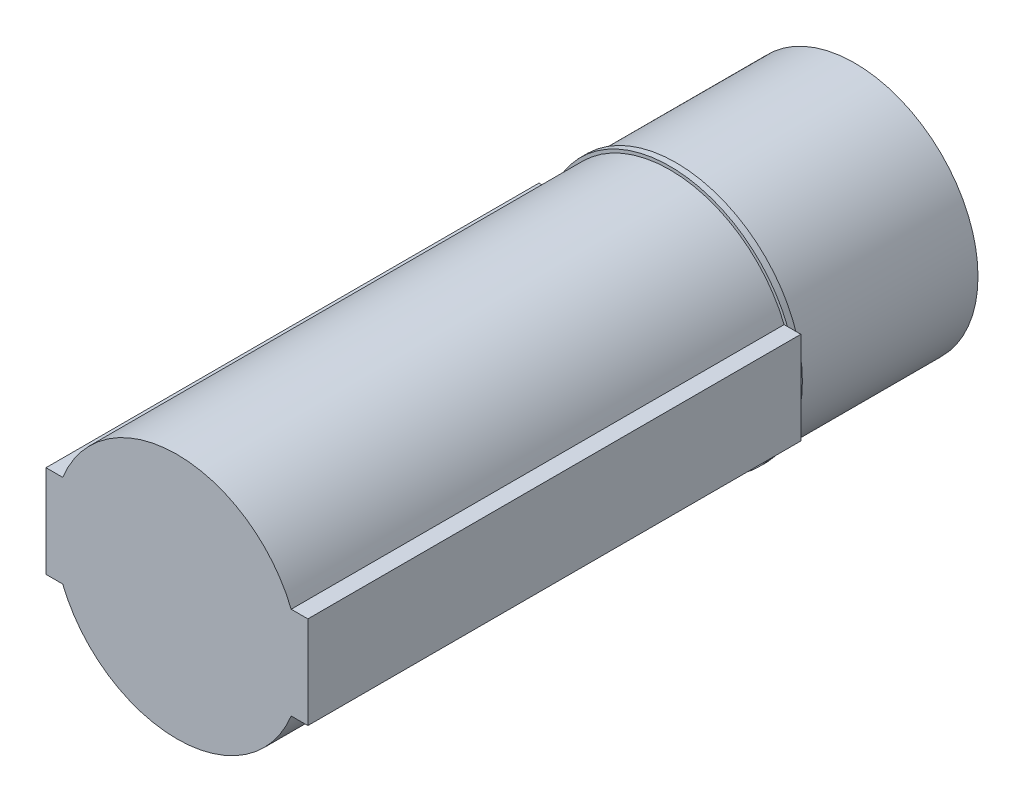
ISO-10303-21;
HEADER;
FILE_DESCRIPTION(('STEP AP214'),'2;1');
FILE_NAME('part.step','',(''),(''),'','','');
FILE_SCHEMA(('AUTOMOTIVE_DESIGN { 1 0 10303 214 1 1 1 1 }'));
ENDSEC;
DATA;
#1=APPLICATION_CONTEXT('core data for automotive mechanical design processes');
#2=APPLICATION_PROTOCOL_DEFINITION('international standard','automotive_design',2000,#1);
#3=PRODUCT_CONTEXT('',#1,'mechanical');
#4=PRODUCT('Part','Part','',(#3));
#5=PRODUCT_RELATED_PRODUCT_CATEGORY('part','',(#4));
#6=PRODUCT_DEFINITION_FORMATION('','',#4);
#7=PRODUCT_DEFINITION_CONTEXT('part definition',#1,'design');
#8=PRODUCT_DEFINITION('design','',#6,#7);
#9=PRODUCT_DEFINITION_SHAPE('','',#8);
#10=(LENGTH_UNIT() NAMED_UNIT(*) SI_UNIT(.MILLI.,.METRE.));
#11=(NAMED_UNIT(*) PLANE_ANGLE_UNIT() SI_UNIT($,.RADIAN.));
#12=(NAMED_UNIT(*) SI_UNIT($,.STERADIAN.) SOLID_ANGLE_UNIT());
#13=UNCERTAINTY_MEASURE_WITH_UNIT(LENGTH_MEASURE(1.E-05),#10,'distance_accuracy_value','');
#14=(GEOMETRIC_REPRESENTATION_CONTEXT(3) GLOBAL_UNCERTAINTY_ASSIGNED_CONTEXT((#13)) GLOBAL_UNIT_ASSIGNED_CONTEXT((#10,
#11,#12)) REPRESENTATION_CONTEXT('',''));
#15=CARTESIAN_POINT('',(0.,0.,0.));
#16=DIRECTION('',(0.,0.,1.));
#17=DIRECTION('',(1.,0.,0.));
#18=AXIS2_PLACEMENT_3D('',#15,#16,#17);
#19=CARTESIAN_POINT('',(0.,0.,7.));
#20=DIRECTION('',(0.,0.,-1.));
#21=DIRECTION('',(-1.,0.,0.));
#22=AXIS2_PLACEMENT_3D('',#19,#20,#21);
#23=CYLINDRICAL_SURFACE('',#22,2.);
#24=CARTESIAN_POINT('',(0.,0.,3.));
#25=DIRECTION('',(0.,0.,1.));
#26=DIRECTION('',(1.,0.,0.));
#27=AXIS2_PLACEMENT_3D('',#24,#25,#26);
#28=CIRCLE('',#27,2.);
#29=CARTESIAN_POINT('',(1.85404962177392,0.75,3.));
#30=VERTEX_POINT('',#29);
#31=CARTESIAN_POINT('',(-1.85404962177392,0.75,3.));
#32=VERTEX_POINT('',#31);
#33=EDGE_CURVE('E206',#30,#32,#28,.T.);
#34=ORIENTED_EDGE('',*,*,#33,.T.);
#35=DIRECTION('',(0.,0.,-1.));
#36=VECTOR('',#35,1.);
#37=CARTESIAN_POINT('',(-1.85404962177392,0.75,11.));
#38=LINE('',#37,#36);
#39=CARTESIAN_POINT('',(-1.85404962177392,0.75,11.));
#40=VERTEX_POINT('',#39);
#41=EDGE_CURVE('E190',#40,#32,#38,.T.);
#42=ORIENTED_EDGE('',*,*,#41,.F.);
#43=CARTESIAN_POINT('',(0.,0.,11.));
#44=DIRECTION('',(0.,0.,1.));
#45=DIRECTION('',(1.,0.,0.));
#46=AXIS2_PLACEMENT_3D('',#43,#44,#45);
#47=CIRCLE('',#46,2.);
#48=CARTESIAN_POINT('',(1.85404962177392,0.75,11.));
#49=VERTEX_POINT('',#48);
#50=EDGE_CURVE('E172',#49,#40,#47,.T.);
#51=ORIENTED_EDGE('',*,*,#50,.F.);
#52=DIRECTION('',(0.,0.,-1.));
#53=VECTOR('',#52,1.);
#54=CARTESIAN_POINT('',(1.85404962177392,0.75,11.));
#55=LINE('',#54,#53);
#56=EDGE_CURVE('E192',#49,#30,#55,.T.);
#57=ORIENTED_EDGE('',*,*,#56,.T.);
#58=EDGE_LOOP('',(#34,#42,#51,#57));
#59=FACE_BOUND('',#58,.T.);
#60=ADVANCED_FACE('F34',(#59),#23,.T.);
#61=CARTESIAN_POINT('',(0.,0.,3.));
#62=DIRECTION('',(0.,0.,1.));
#63=DIRECTION('',(1.,0.,0.));
#64=AXIS2_PLACEMENT_3D('',#61,#62,#63);
#65=PLANE('',#64);
#66=DIRECTION('',(-1.,0.,0.));
#67=VECTOR('',#66,1.);
#68=CARTESIAN_POINT('',(-1.85404962177392,0.75,3.));
#69=LINE('',#68,#67);
#70=CARTESIAN_POINT('',(-1.90787840283389,0.75,3.));
#71=VERTEX_POINT('',#70);
#72=EDGE_CURVE('E153',#32,#71,#69,.T.);
#73=ORIENTED_EDGE('',*,*,#72,.F.);
#74=ORIENTED_EDGE('',*,*,#33,.F.);
#75=DIRECTION('',(-1.,0.,0.));
#76=VECTOR('',#75,1.);
#77=CARTESIAN_POINT('',(2.125,0.75,3.));
#78=LINE('',#77,#76);
#79=CARTESIAN_POINT('',(1.90787840283389,0.75,3.));
#80=VERTEX_POINT('',#79);
#81=EDGE_CURVE('E163',#80,#30,#78,.T.);
#82=ORIENTED_EDGE('',*,*,#81,.F.);
#83=CARTESIAN_POINT('',(0.,0.,3.));
#84=DIRECTION('',(0.,0.,1.));
#85=DIRECTION('',(1.,0.,0.));
#86=AXIS2_PLACEMENT_3D('',#83,#84,#85);
#87=CIRCLE('',#86,2.05);
#88=EDGE_CURVE('E210',#80,#71,#87,.T.);
#89=ORIENTED_EDGE('',*,*,#88,.T.);
#90=EDGE_LOOP('',(#73,#74,#82,#89));
#91=FACE_BOUND('',#90,.T.);
#92=ADVANCED_FACE('F227',(#91),#65,.T.);
#93=CARTESIAN_POINT('',(0.,0.,0.));
#94=DIRECTION('',(0.,0.,1.));
#95=DIRECTION('',(1.,0.,0.));
#96=AXIS2_PLACEMENT_3D('',#93,#94,#95);
#97=PLANE('',#96);
#98=CARTESIAN_POINT('',(0.,0.,0.));
#99=DIRECTION('',(0.,0.,1.));
#100=DIRECTION('',(1.,0.,0.));
#101=AXIS2_PLACEMENT_3D('',#98,#99,#100);
#102=CIRCLE('',#101,1.5);
#103=CARTESIAN_POINT('',(0.997797574661314,1.12,0.));
#104=VERTEX_POINT('',#103);
#105=CARTESIAN_POINT('',(0.997797574661314,-1.12,0.));
#106=VERTEX_POINT('',#105);
#107=EDGE_CURVE('E55',#104,#106,#102,.T.);
#108=ORIENTED_EDGE('',*,*,#107,.T.);
#109=DIRECTION('',(0.,1.,0.));
#110=VECTOR('',#109,1.);
#111=CARTESIAN_POINT('',(0.997797574661314,1.12,0.));
#112=LINE('',#111,#110);
#113=EDGE_CURVE('E217',#106,#104,#112,.T.);
#114=ORIENTED_EDGE('',*,*,#113,.T.);
#115=EDGE_LOOP('',(#108,#114));
#116=FACE_BOUND('',#115,.T.);
#117=CARTESIAN_POINT('',(0.,0.,0.));
#118=DIRECTION('',(0.,0.,1.));
#119=DIRECTION('',(1.,0.,0.));
#120=AXIS2_PLACEMENT_3D('',#117,#118,#119);
#121=CIRCLE('',#120,2.);
#122=CARTESIAN_POINT('',(2.,0.,0.));
#123=VERTEX_POINT('',#122);
#124=EDGE_CURVE('E196',#123,#123,#121,.T.);
#125=ORIENTED_EDGE('',*,*,#124,.F.);
#126=EDGE_LOOP('',(#125));
#127=FACE_BOUND('',#126,.T.);
#128=ADVANCED_FACE('F224',(#116,#127),#97,.F.);
#129=DIRECTION('',(0.,0.,-1.));
#130=VECTOR('',#129,1.);
#131=CARTESIAN_POINT('',(-1.85404962177392,-0.75,11.));
#132=LINE('',#131,#130);
#133=CARTESIAN_POINT('',(-1.85404962177392,-0.75,11.));
#134=VERTEX_POINT('',#133);
#135=CARTESIAN_POINT('',(-1.85404962177392,-0.75,3.));
#136=VERTEX_POINT('',#135);
#137=EDGE_CURVE('E137',#134,#136,#132,.T.);
#138=ORIENTED_EDGE('',*,*,#137,.T.);
#139=CARTESIAN_POINT('',(1.85404962177392,-0.75,3.));
#140=VERTEX_POINT('',#139);
#141=EDGE_CURVE('E205',#136,#140,#28,.T.);
#142=ORIENTED_EDGE('',*,*,#141,.T.);
#143=DIRECTION('',(0.,0.,-1.));
#144=VECTOR('',#143,1.);
#145=CARTESIAN_POINT('',(1.85404962177392,-0.75,11.));
#146=LINE('',#145,#144);
#147=CARTESIAN_POINT('',(1.85404962177392,-0.75,11.));
#148=VERTEX_POINT('',#147);
#149=EDGE_CURVE('E185',#148,#140,#146,.T.);
#150=ORIENTED_EDGE('',*,*,#149,.F.);
#151=CARTESIAN_POINT('',(0.,0.,11.));
#152=DIRECTION('',(0.,0.,1.));
#153=DIRECTION('',(1.,0.,0.));
#154=AXIS2_PLACEMENT_3D('',#151,#152,#153);
#155=CIRCLE('',#154,2.);
#156=EDGE_CURVE('E179',#134,#148,#155,.T.);
#157=ORIENTED_EDGE('',*,*,#156,.F.);
#158=EDGE_LOOP('',(#138,#142,#150,#157));
#159=FACE_BOUND('',#158,.T.);
#160=ADVANCED_FACE('F36',(#159),#23,.T.);
#161=CARTESIAN_POINT('',(0.,0.,7.));
#162=DIRECTION('',(0.,0.,-1.));
#163=DIRECTION('',(-1.,0.,0.));
#164=AXIS2_PLACEMENT_3D('',#161,#162,#163);
#165=CYLINDRICAL_SURFACE('',#164,1.5);
#166=ORIENTED_EDGE('',*,*,#107,.F.);
#167=DIRECTION('',(0.,0.,-1.));
#168=VECTOR('',#167,1.);
#169=CARTESIAN_POINT('',(0.997797574661314,1.12,7.));
#170=LINE('',#169,#168);
#171=CARTESIAN_POINT('',(0.997797574661314,1.12,7.));
#172=VERTEX_POINT('',#171);
#173=EDGE_CURVE('E42',#172,#104,#170,.T.);
#174=ORIENTED_EDGE('',*,*,#173,.F.);
#175=CARTESIAN_POINT('',(0.,0.,7.));
#176=DIRECTION('',(0.,0.,1.));
#177=DIRECTION('',(1.,0.,0.));
#178=AXIS2_PLACEMENT_3D('',#175,#176,#177);
#179=CIRCLE('',#178,1.5);
#180=CARTESIAN_POINT('',(0.997797574661314,-1.12,7.));
#181=VERTEX_POINT('',#180);
#182=EDGE_CURVE('E214',#172,#181,#179,.T.);
#183=ORIENTED_EDGE('',*,*,#182,.T.);
#184=DIRECTION('',(0.,0.,-1.));
#185=VECTOR('',#184,1.);
#186=CARTESIAN_POINT('',(0.997797574661314,-1.12,7.));
#187=LINE('',#186,#185);
#188=EDGE_CURVE('E11',#181,#106,#187,.T.);
#189=ORIENTED_EDGE('',*,*,#188,.T.);
#190=EDGE_LOOP('',(#166,#174,#183,#189));
#191=FACE_BOUND('',#190,.T.);
#192=ADVANCED_FACE('F256',(#191),#165,.F.);
#193=CARTESIAN_POINT('',(0.997797574661314,1.12,7.));
#194=DIRECTION('',(-1.,0.,0.));
#195=DIRECTION('',(0.,0.,1.));
#196=AXIS2_PLACEMENT_3D('',#193,#194,#195);
#197=PLANE('',#196);
#198=ORIENTED_EDGE('',*,*,#113,.F.);
#199=ORIENTED_EDGE('',*,*,#188,.F.);
#200=DIRECTION('',(0.,1.,0.));
#201=VECTOR('',#200,1.);
#202=CARTESIAN_POINT('',(0.997797574661314,1.12,7.));
#203=LINE('',#202,#201);
#204=EDGE_CURVE('E48',#181,#172,#203,.T.);
#205=ORIENTED_EDGE('',*,*,#204,.T.);
#206=ORIENTED_EDGE('',*,*,#173,.T.);
#207=EDGE_LOOP('',(#198,#199,#205,#206));
#208=FACE_BOUND('',#207,.T.);
#209=ADVANCED_FACE('F222',(#208),#197,.T.);
#210=DIRECTION('',(1.,0.,0.));
#211=VECTOR('',#210,1.);
#212=CARTESIAN_POINT('',(-2.125,-0.75,3.));
#213=LINE('',#212,#211);
#214=CARTESIAN_POINT('',(-1.90787840283389,-0.75,3.));
#215=VERTEX_POINT('',#214);
#216=EDGE_CURVE('E146',#215,#136,#213,.T.);
#217=ORIENTED_EDGE('',*,*,#216,.F.);
#218=CARTESIAN_POINT('',(1.90787840283389,-0.75,3.));
#219=VERTEX_POINT('',#218);
#220=EDGE_CURVE('E213',#215,#219,#87,.T.);
#221=ORIENTED_EDGE('',*,*,#220,.T.);
#222=DIRECTION('',(1.,0.,0.));
#223=VECTOR('',#222,1.);
#224=CARTESIAN_POINT('',(1.85404962177392,-0.75,3.));
#225=LINE('',#224,#223);
#226=EDGE_CURVE('E157',#140,#219,#225,.T.);
#227=ORIENTED_EDGE('',*,*,#226,.F.);
#228=ORIENTED_EDGE('',*,*,#141,.F.);
#229=EDGE_LOOP('',(#217,#221,#227,#228));
#230=FACE_BOUND('',#229,.T.);
#231=ADVANCED_FACE('F254',(#230),#65,.T.);
#232=CARTESIAN_POINT('',(0.,0.,3.));
#233=DIRECTION('',(0.,0.,-1.));
#234=DIRECTION('',(-1.,0.,0.));
#235=AXIS2_PLACEMENT_3D('',#232,#233,#234);
#236=CYLINDRICAL_SURFACE('',#235,2.05);
#237=CARTESIAN_POINT('',(0.,0.,2.9));
#238=DIRECTION('',(0.,0.,1.));
#239=DIRECTION('',(1.,0.,0.));
#240=AXIS2_PLACEMENT_3D('',#237,#238,#239);
#241=CIRCLE('',#240,2.05);
#242=CARTESIAN_POINT('',(2.05,0.,2.9));
#243=VERTEX_POINT('',#242);
#244=EDGE_CURVE('E200',#243,#243,#241,.T.);
#245=ORIENTED_EDGE('',*,*,#244,.T.);
#246=EDGE_LOOP('',(#245));
#247=FACE_BOUND('',#246,.T.);
#248=ORIENTED_EDGE('',*,*,#88,.F.);
#249=EDGE_CURVE('E209',#219,#80,#87,.T.);
#250=ORIENTED_EDGE('',*,*,#249,.F.);
#251=ORIENTED_EDGE('',*,*,#220,.F.);
#252=EDGE_CURVE('E144',#71,#215,#87,.T.);
#253=ORIENTED_EDGE('',*,*,#252,.F.);
#254=EDGE_LOOP('',(#248,#250,#251,#253));
#255=FACE_BOUND('',#254,.T.);
#256=ADVANCED_FACE('F242',(#247,#255),#236,.T.);
#257=CARTESIAN_POINT('',(0.,0.,2.9));
#258=DIRECTION('',(0.,0.,1.));
#259=DIRECTION('',(1.,0.,0.));
#260=AXIS2_PLACEMENT_3D('',#257,#258,#259);
#261=PLANE('',#260);
#262=ORIENTED_EDGE('',*,*,#244,.F.);
#263=EDGE_LOOP('',(#262));
#264=FACE_BOUND('',#263,.T.);
#265=CARTESIAN_POINT('',(0.,0.,2.9));
#266=DIRECTION('',(0.,0.,1.));
#267=DIRECTION('',(1.,0.,0.));
#268=AXIS2_PLACEMENT_3D('',#265,#266,#267);
#269=CIRCLE('',#268,2.);
#270=CARTESIAN_POINT('',(2.,0.,2.9));
#271=VERTEX_POINT('',#270);
#272=EDGE_CURVE('E197',#271,#271,#269,.T.);
#273=ORIENTED_EDGE('',*,*,#272,.T.);
#274=EDGE_LOOP('',(#273));
#275=FACE_BOUND('',#274,.T.);
#276=ADVANCED_FACE('F233',(#264,#275),#261,.F.);
#277=CARTESIAN_POINT('',(0.,0.,2.9));
#278=DIRECTION('',(0.,0.,-1.));
#279=DIRECTION('',(-1.,0.,0.));
#280=AXIS2_PLACEMENT_3D('',#277,#278,#279);
#281=CYLINDRICAL_SURFACE('',#280,2.);
#282=ORIENTED_EDGE('',*,*,#272,.F.);
#283=EDGE_LOOP('',(#282));
#284=FACE_BOUND('',#283,.T.);
#285=ORIENTED_EDGE('',*,*,#124,.T.);
#286=EDGE_LOOP('',(#285));
#287=FACE_BOUND('',#286,.T.);
#288=ADVANCED_FACE('F230',(#284,#287),#281,.T.);
#289=CARTESIAN_POINT('',(0.,0.,7.));
#290=DIRECTION('',(0.,0.,1.));
#291=DIRECTION('',(1.,0.,0.));
#292=AXIS2_PLACEMENT_3D('',#289,#290,#291);
#293=PLANE('',#292);
#294=ORIENTED_EDGE('',*,*,#204,.F.);
#295=ORIENTED_EDGE('',*,*,#182,.F.);
#296=EDGE_LOOP('',(#294,#295));
#297=FACE_BOUND('',#296,.T.);
#298=ADVANCED_FACE('F232',(#297),#293,.F.);
#299=CARTESIAN_POINT('',(2.125,-0.75,11.));
#300=DIRECTION('',(-1.,0.,0.));
#301=DIRECTION('',(0.,0.,1.));
#302=AXIS2_PLACEMENT_3D('',#299,#300,#301);
#303=PLANE('',#302);
#304=DIRECTION('',(0.,0.,-1.));
#305=VECTOR('',#304,1.);
#306=CARTESIAN_POINT('',(2.125,-0.75,11.));
#307=LINE('',#306,#305);
#308=CARTESIAN_POINT('',(2.125,-0.75,11.));
#309=VERTEX_POINT('',#308);
#310=CARTESIAN_POINT('',(2.125,-0.75,3.));
#311=VERTEX_POINT('',#310);
#312=EDGE_CURVE('E183',#309,#311,#307,.T.);
#313=ORIENTED_EDGE('',*,*,#312,.T.);
#314=DIRECTION('',(0.,1.,0.));
#315=VECTOR('',#314,1.);
#316=CARTESIAN_POINT('',(2.125,-0.75,3.));
#317=LINE('',#316,#315);
#318=CARTESIAN_POINT('',(2.125,0.75,3.));
#319=VERTEX_POINT('',#318);
#320=EDGE_CURVE('E160',#311,#319,#317,.T.);
#321=ORIENTED_EDGE('',*,*,#320,.T.);
#322=DIRECTION('',(0.,0.,-1.));
#323=VECTOR('',#322,1.);
#324=CARTESIAN_POINT('',(2.125,0.75,11.));
#325=LINE('',#324,#323);
#326=CARTESIAN_POINT('',(2.125,0.75,11.));
#327=VERTEX_POINT('',#326);
#328=EDGE_CURVE('E194',#327,#319,#325,.T.);
#329=ORIENTED_EDGE('',*,*,#328,.F.);
#330=DIRECTION('',(0.,1.,0.));
#331=VECTOR('',#330,1.);
#332=CARTESIAN_POINT('',(2.125,-0.75,11.));
#333=LINE('',#332,#331);
#334=EDGE_CURVE('E167',#309,#327,#333,.T.);
#335=ORIENTED_EDGE('',*,*,#334,.F.);
#336=EDGE_LOOP('',(#313,#321,#329,#335));
#337=FACE_BOUND('',#336,.T.);
#338=ADVANCED_FACE('F240',(#337),#303,.F.);
#339=CARTESIAN_POINT('',(1.85404962177392,0.75,11.));
#340=DIRECTION('',(0.,-1.,0.));
#341=DIRECTION('',(0.,0.,-1.));
#342=AXIS2_PLACEMENT_3D('',#339,#340,#341);
#343=PLANE('',#342);
#344=ORIENTED_EDGE('',*,*,#328,.T.);
#345=EDGE_CURVE('E164',#319,#80,#78,.T.);
#346=ORIENTED_EDGE('',*,*,#345,.T.);
#347=ORIENTED_EDGE('',*,*,#81,.T.);
#348=ORIENTED_EDGE('',*,*,#56,.F.);
#349=DIRECTION('',(-1.,0.,0.));
#350=VECTOR('',#349,1.);
#351=CARTESIAN_POINT('',(1.85404962177392,0.75,11.));
#352=LINE('',#351,#350);
#353=EDGE_CURVE('E170',#327,#49,#352,.T.);
#354=ORIENTED_EDGE('',*,*,#353,.F.);
#355=EDGE_LOOP('',(#344,#346,#347,#348,#354));
#356=FACE_BOUND('',#355,.T.);
#357=ADVANCED_FACE('F284',(#356),#343,.F.);
#358=CARTESIAN_POINT('',(-2.125,0.75,11.));
#359=DIRECTION('',(0.,-1.,0.));
#360=DIRECTION('',(0.,0.,-1.));
#361=AXIS2_PLACEMENT_3D('',#358,#359,#360);
#362=PLANE('',#361);
#363=ORIENTED_EDGE('',*,*,#41,.T.);
#364=ORIENTED_EDGE('',*,*,#72,.T.);
#365=CARTESIAN_POINT('',(-2.125,0.75,3.));
#366=VERTEX_POINT('',#365);
#367=EDGE_CURVE('E145',#71,#366,#69,.T.);
#368=ORIENTED_EDGE('',*,*,#367,.T.);
#369=DIRECTION('',(0.,0.,-1.));
#370=VECTOR('',#369,1.);
#371=CARTESIAN_POINT('',(-2.125,0.75,11.));
#372=LINE('',#371,#370);
#373=CARTESIAN_POINT('',(-2.125,0.75,11.));
#374=VERTEX_POINT('',#373);
#375=EDGE_CURVE('E136',#374,#366,#372,.T.);
#376=ORIENTED_EDGE('',*,*,#375,.F.);
#377=DIRECTION('',(-1.,0.,0.));
#378=VECTOR('',#377,1.);
#379=CARTESIAN_POINT('',(-2.125,0.75,11.));
#380=LINE('',#379,#378);
#381=EDGE_CURVE('E174',#40,#374,#380,.T.);
#382=ORIENTED_EDGE('',*,*,#381,.F.);
#383=EDGE_LOOP('',(#363,#364,#368,#376,#382));
#384=FACE_BOUND('',#383,.T.);
#385=ADVANCED_FACE('F300',(#384),#362,.F.);
#386=CARTESIAN_POINT('',(-2.125,-0.75,11.));
#387=DIRECTION('',(1.,0.,0.));
#388=DIRECTION('',(0.,0.,-1.));
#389=AXIS2_PLACEMENT_3D('',#386,#387,#388);
#390=PLANE('',#389);
#391=ORIENTED_EDGE('',*,*,#375,.T.);
#392=DIRECTION('',(0.,-1.,0.));
#393=VECTOR('',#392,1.);
#394=CARTESIAN_POINT('',(-2.125,0.75,3.));
#395=LINE('',#394,#393);
#396=CARTESIAN_POINT('',(-2.125,-0.75,3.));
#397=VERTEX_POINT('',#396);
#398=EDGE_CURVE('E142',#366,#397,#395,.T.);
#399=ORIENTED_EDGE('',*,*,#398,.T.);
#400=DIRECTION('',(0.,0.,-1.));
#401=VECTOR('',#400,1.);
#402=CARTESIAN_POINT('',(-2.125,-0.75,11.));
#403=LINE('',#402,#401);
#404=CARTESIAN_POINT('',(-2.125,-0.75,11.));
#405=VERTEX_POINT('',#404);
#406=EDGE_CURVE('E125',#405,#397,#403,.T.);
#407=ORIENTED_EDGE('',*,*,#406,.F.);
#408=DIRECTION('',(0.,-1.,0.));
#409=VECTOR('',#408,1.);
#410=CARTESIAN_POINT('',(-2.125,-0.75,11.));
#411=LINE('',#410,#409);
#412=EDGE_CURVE('E176',#374,#405,#411,.T.);
#413=ORIENTED_EDGE('',*,*,#412,.F.);
#414=EDGE_LOOP('',(#391,#399,#407,#413));
#415=FACE_BOUND('',#414,.T.);
#416=ADVANCED_FACE('F148',(#415),#390,.F.);
#417=CARTESIAN_POINT('',(-2.125,-0.75,11.));
#418=DIRECTION('',(0.,1.,0.));
#419=DIRECTION('',(0.,0.,1.));
#420=AXIS2_PLACEMENT_3D('',#417,#418,#419);
#421=PLANE('',#420);
#422=ORIENTED_EDGE('',*,*,#406,.T.);
#423=EDGE_CURVE('E129',#397,#215,#213,.T.);
#424=ORIENTED_EDGE('',*,*,#423,.T.);
#425=ORIENTED_EDGE('',*,*,#216,.T.);
#426=ORIENTED_EDGE('',*,*,#137,.F.);
#427=DIRECTION('',(1.,0.,0.));
#428=VECTOR('',#427,1.);
#429=CARTESIAN_POINT('',(-2.125,-0.75,11.));
#430=LINE('',#429,#428);
#431=EDGE_CURVE('E132',#405,#134,#430,.T.);
#432=ORIENTED_EDGE('',*,*,#431,.F.);
#433=EDGE_LOOP('',(#422,#424,#425,#426,#432));
#434=FACE_BOUND('',#433,.T.);
#435=ADVANCED_FACE('F127',(#434),#421,.F.);
#436=CARTESIAN_POINT('',(1.85404962177392,-0.75,11.));
#437=DIRECTION('',(0.,1.,0.));
#438=DIRECTION('',(0.,0.,1.));
#439=AXIS2_PLACEMENT_3D('',#436,#437,#438);
#440=PLANE('',#439);
#441=ORIENTED_EDGE('',*,*,#149,.T.);
#442=ORIENTED_EDGE('',*,*,#226,.T.);
#443=EDGE_CURVE('E156',#219,#311,#225,.T.);
#444=ORIENTED_EDGE('',*,*,#443,.T.);
#445=ORIENTED_EDGE('',*,*,#312,.F.);
#446=DIRECTION('',(1.,0.,0.));
#447=VECTOR('',#446,1.);
#448=CARTESIAN_POINT('',(1.85404962177392,-0.75,11.));
#449=LINE('',#448,#447);
#450=EDGE_CURVE('E181',#148,#309,#449,.T.);
#451=ORIENTED_EDGE('',*,*,#450,.F.);
#452=EDGE_LOOP('',(#441,#442,#444,#445,#451));
#453=FACE_BOUND('',#452,.T.);
#454=ADVANCED_FACE('F272',(#453),#440,.F.);
#455=CARTESIAN_POINT('',(0.,0.,11.));
#456=DIRECTION('',(0.,0.,1.));
#457=DIRECTION('',(1.,0.,0.));
#458=AXIS2_PLACEMENT_3D('',#455,#456,#457);
#459=PLANE('',#458);
#460=ORIENTED_EDGE('',*,*,#50,.T.);
#461=ORIENTED_EDGE('',*,*,#381,.T.);
#462=ORIENTED_EDGE('',*,*,#412,.T.);
#463=ORIENTED_EDGE('',*,*,#431,.T.);
#464=ORIENTED_EDGE('',*,*,#156,.T.);
#465=ORIENTED_EDGE('',*,*,#450,.T.);
#466=ORIENTED_EDGE('',*,*,#334,.T.);
#467=ORIENTED_EDGE('',*,*,#353,.T.);
#468=EDGE_LOOP('',(#460,#461,#462,#463,#464,#465,#466,#467));
#469=FACE_BOUND('',#468,.T.);
#470=ADVANCED_FACE('F294',(#469),#459,.T.);
#471=CARTESIAN_POINT('',(0.,0.,3.));
#472=DIRECTION('',(0.,0.,1.));
#473=DIRECTION('',(1.,0.,0.));
#474=AXIS2_PLACEMENT_3D('',#471,#472,#473);
#475=PLANE('',#474);
#476=ORIENTED_EDGE('',*,*,#443,.F.);
#477=ORIENTED_EDGE('',*,*,#249,.T.);
#478=ORIENTED_EDGE('',*,*,#345,.F.);
#479=ORIENTED_EDGE('',*,*,#320,.F.);
#480=EDGE_LOOP('',(#476,#477,#478,#479));
#481=FACE_BOUND('',#480,.T.);
#482=ADVANCED_FACE('F280',(#481),#475,.F.);
#483=CARTESIAN_POINT('',(0.,0.,3.));
#484=DIRECTION('',(0.,0.,1.));
#485=DIRECTION('',(1.,0.,0.));
#486=AXIS2_PLACEMENT_3D('',#483,#484,#485);
#487=PLANE('',#486);
#488=ORIENTED_EDGE('',*,*,#367,.F.);
#489=ORIENTED_EDGE('',*,*,#252,.T.);
#490=ORIENTED_EDGE('',*,*,#423,.F.);
#491=ORIENTED_EDGE('',*,*,#398,.F.);
#492=EDGE_LOOP('',(#488,#489,#490,#491));
#493=FACE_BOUND('',#492,.T.);
#494=ADVANCED_FACE('F141',(#493),#487,.F.);
#495=CLOSED_SHELL('',(#60,#92,#128,#160,#192,#209,#231,#256,#276,#288,#298,#338,#357,#385,#416,
#435,#454,#470,#482,#494));
#496=MANIFOLD_SOLID_BREP('B2',#495);
#497=ADVANCED_BREP_SHAPE_REPRESENTATION('',(#18,#496),#14);
#498=SHAPE_DEFINITION_REPRESENTATION(#9,#497);
ENDSEC;
END-ISO-10303-21;
